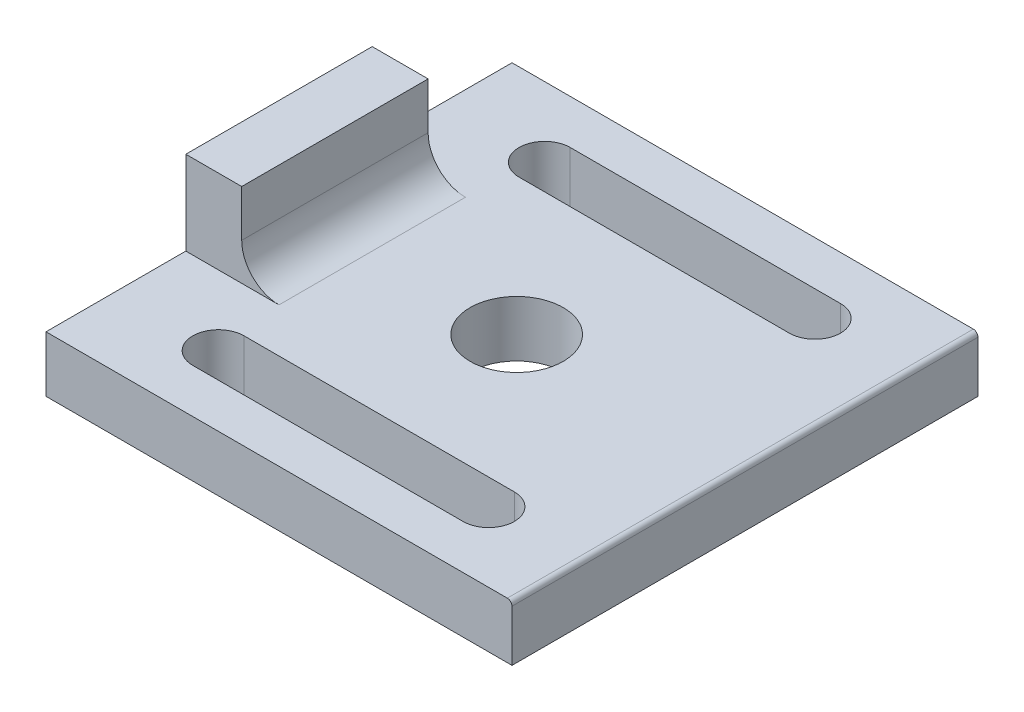
ISO-10303-21;
HEADER;
FILE_DESCRIPTION(('STEP AP214'),'2;1');
FILE_NAME('part.step','',(''),(''),'','','');
FILE_SCHEMA(('AUTOMOTIVE_DESIGN { 1 0 10303 214 1 1 1 1 }'));
ENDSEC;
DATA;
#1=APPLICATION_CONTEXT('core data for automotive mechanical design processes');
#2=APPLICATION_PROTOCOL_DEFINITION('international standard','automotive_design',2000,#1);
#3=PRODUCT_CONTEXT('',#1,'mechanical');
#4=PRODUCT('Part','Part','',(#3));
#5=PRODUCT_RELATED_PRODUCT_CATEGORY('part','',(#4));
#6=PRODUCT_DEFINITION_FORMATION('','',#4);
#7=PRODUCT_DEFINITION_CONTEXT('part definition',#1,'design');
#8=PRODUCT_DEFINITION('design','',#6,#7);
#9=PRODUCT_DEFINITION_SHAPE('','',#8);
#10=(LENGTH_UNIT() NAMED_UNIT(*) SI_UNIT(.MILLI.,.METRE.));
#11=(NAMED_UNIT(*) PLANE_ANGLE_UNIT() SI_UNIT($,.RADIAN.));
#12=(NAMED_UNIT(*) SI_UNIT($,.STERADIAN.) SOLID_ANGLE_UNIT());
#13=UNCERTAINTY_MEASURE_WITH_UNIT(LENGTH_MEASURE(1.E-05),#10,'distance_accuracy_value','');
#14=(GEOMETRIC_REPRESENTATION_CONTEXT(3) GLOBAL_UNCERTAINTY_ASSIGNED_CONTEXT((#13)) GLOBAL_UNIT_ASSIGNED_CONTEXT((#10,
#11,#12)) REPRESENTATION_CONTEXT('',''));
#15=CARTESIAN_POINT('',(0.,0.,0.));
#16=DIRECTION('',(0.,0.,1.));
#17=DIRECTION('',(1.,0.,0.));
#18=AXIS2_PLACEMENT_3D('',#15,#16,#17);
#19=CARTESIAN_POINT('',(-19.5,10.,25.));
#20=DIRECTION('',(-1.,0.,0.));
#21=DIRECTION('',(0.,0.,1.));
#22=AXIS2_PLACEMENT_3D('',#19,#20,#21);
#23=PLANE('',#22);
#24=DIRECTION('',(0.,1.,0.));
#25=VECTOR('',#24,1.);
#26=CARTESIAN_POINT('',(-19.5,21.,-10.));
#27=LINE('',#26,#25);
#28=CARTESIAN_POINT('',(-19.5,10.,-10.));
#29=VERTEX_POINT('',#28);
#30=CARTESIAN_POINT('',(-19.5,15.,-10.));
#31=VERTEX_POINT('',#30);
#32=EDGE_CURVE('E134',#29,#31,#27,.T.);
#33=ORIENTED_EDGE('',*,*,#32,.T.);
#34=DIRECTION('',(0.,0.,-1.));
#35=VECTOR('',#34,1.);
#36=CARTESIAN_POINT('',(-19.5,15.,25.));
#37=LINE('',#36,#35);
#38=CARTESIAN_POINT('',(-19.5,15.,10.));
#39=VERTEX_POINT('',#38);
#40=EDGE_CURVE('E137',#31,#39,#37,.F.);
#41=ORIENTED_EDGE('',*,*,#40,.T.);
#42=DIRECTION('',(0.,1.,0.));
#43=VECTOR('',#42,1.);
#44=CARTESIAN_POINT('',(-19.5,6.,10.));
#45=LINE('',#44,#43);
#46=CARTESIAN_POINT('',(-19.5,10.,10.));
#47=VERTEX_POINT('',#46);
#48=EDGE_CURVE('E122',#39,#47,#45,.F.);
#49=ORIENTED_EDGE('',*,*,#48,.T.);
#50=DIRECTION('',(0.,0.,1.));
#51=VECTOR('',#50,1.);
#52=CARTESIAN_POINT('',(-19.5,10.,25.));
#53=LINE('',#52,#51);
#54=EDGE_CURVE('E112',#47,#29,#53,.F.);
#55=ORIENTED_EDGE('',*,*,#54,.T.);
#56=EDGE_LOOP('',(#33,#41,#49,#55));
#57=FACE_BOUND('',#56,.T.);
#58=ADVANCED_FACE('F17',(#57),#23,.F.);
#59=CARTESIAN_POINT('',(-15.5,10.,25.));
#60=DIRECTION('',(0.,0.,1.));
#61=DIRECTION('',(1.,0.,0.));
#62=AXIS2_PLACEMENT_3D('',#59,#60,#61);
#63=CYLINDRICAL_SURFACE('',#62,4.);
#64=ORIENTED_EDGE('',*,*,#54,.F.);
#65=CARTESIAN_POINT('',(-15.5,10.,10.));
#66=DIRECTION('',(0.,0.,1.));
#67=DIRECTION('',(1.,0.,0.));
#68=AXIS2_PLACEMENT_3D('',#65,#66,#67);
#69=CIRCLE('',#68,4.);
#70=CARTESIAN_POINT('',(-15.5,6.,10.));
#71=VERTEX_POINT('',#70);
#72=EDGE_CURVE('E20',#47,#71,#69,.T.);
#73=ORIENTED_EDGE('',*,*,#72,.T.);
#74=DIRECTION('',(0.,0.,-1.));
#75=VECTOR('',#74,1.);
#76=CARTESIAN_POINT('',(-15.5,6.,25.));
#77=LINE('',#76,#75);
#78=CARTESIAN_POINT('',(-15.5,6.,-10.));
#79=VERTEX_POINT('',#78);
#80=EDGE_CURVE('E163',#71,#79,#77,.T.);
#81=ORIENTED_EDGE('',*,*,#80,.T.);
#82=CARTESIAN_POINT('',(-15.5,10.,-10.));
#83=DIRECTION('',(0.,0.,1.));
#84=DIRECTION('',(1.,0.,0.));
#85=AXIS2_PLACEMENT_3D('',#82,#83,#84);
#86=CIRCLE('',#85,4.);
#87=EDGE_CURVE('E117',#79,#29,#86,.F.);
#88=ORIENTED_EDGE('',*,*,#87,.T.);
#89=EDGE_LOOP('',(#64,#73,#81,#88));
#90=FACE_BOUND('',#89,.T.);
#91=ADVANCED_FACE('F114',(#90),#63,.F.);
#92=CARTESIAN_POINT('',(-25.5,6.,10.));
#93=DIRECTION('',(0.,0.,-1.));
#94=DIRECTION('',(-1.,0.,0.));
#95=AXIS2_PLACEMENT_3D('',#92,#93,#94);
#96=PLANE('',#95);
#97=ORIENTED_EDGE('',*,*,#48,.F.);
#98=DIRECTION('',(1.,0.,0.));
#99=VECTOR('',#98,1.);
#100=CARTESIAN_POINT('',(-19.5,15.,10.));
#101=LINE('',#100,#99);
#102=CARTESIAN_POINT('',(-25.5,15.,10.));
#103=VERTEX_POINT('',#102);
#104=EDGE_CURVE('E149',#39,#103,#101,.F.);
#105=ORIENTED_EDGE('',*,*,#104,.T.);
#106=DIRECTION('',(0.,1.,0.));
#107=VECTOR('',#106,1.);
#108=CARTESIAN_POINT('',(-25.5,15.,10.));
#109=LINE('',#108,#107);
#110=CARTESIAN_POINT('',(-25.5,6.,10.));
#111=VERTEX_POINT('',#110);
#112=EDGE_CURVE('E251',#103,#111,#109,.F.);
#113=ORIENTED_EDGE('',*,*,#112,.T.);
#114=DIRECTION('',(1.,0.,0.));
#115=VECTOR('',#114,1.);
#116=CARTESIAN_POINT('',(24.,6.,10.));
#117=LINE('',#116,#115);
#118=EDGE_CURVE('E132',#111,#71,#117,.T.);
#119=ORIENTED_EDGE('',*,*,#118,.T.);
#120=ORIENTED_EDGE('',*,*,#72,.F.);
#121=EDGE_LOOP('',(#97,#105,#113,#119,#120));
#122=FACE_BOUND('',#121,.T.);
#123=ADVANCED_FACE('F127',(#122),#96,.F.);
#124=CARTESIAN_POINT('',(-25.5,21.,-10.));
#125=DIRECTION('',(0.,0.,1.));
#126=DIRECTION('',(1.,0.,0.));
#127=AXIS2_PLACEMENT_3D('',#124,#125,#126);
#128=PLANE('',#127);
#129=DIRECTION('',(1.,0.,0.));
#130=VECTOR('',#129,1.);
#131=CARTESIAN_POINT('',(24.,6.,-10.));
#132=LINE('',#131,#130);
#133=CARTESIAN_POINT('',(-25.5,6.,-10.));
#134=VERTEX_POINT('',#133);
#135=EDGE_CURVE('E166',#79,#134,#132,.F.);
#136=ORIENTED_EDGE('',*,*,#135,.T.);
#137=DIRECTION('',(0.,1.,0.));
#138=VECTOR('',#137,1.);
#139=CARTESIAN_POINT('',(-25.5,15.,-10.));
#140=LINE('',#139,#138);
#141=CARTESIAN_POINT('',(-25.5,15.,-10.));
#142=VERTEX_POINT('',#141);
#143=EDGE_CURVE('E160',#134,#142,#140,.T.);
#144=ORIENTED_EDGE('',*,*,#143,.T.);
#145=DIRECTION('',(1.,0.,0.));
#146=VECTOR('',#145,1.);
#147=CARTESIAN_POINT('',(-19.5,15.,-10.));
#148=LINE('',#147,#146);
#149=EDGE_CURVE('E152',#142,#31,#148,.T.);
#150=ORIENTED_EDGE('',*,*,#149,.T.);
#151=ORIENTED_EDGE('',*,*,#32,.F.);
#152=ORIENTED_EDGE('',*,*,#87,.F.);
#153=EDGE_LOOP('',(#136,#144,#150,#151,#152));
#154=FACE_BOUND('',#153,.T.);
#155=ADVANCED_FACE('F412',(#154),#128,.F.);
#156=CARTESIAN_POINT('',(-19.5,15.,25.));
#157=DIRECTION('',(0.,-1.,0.));
#158=DIRECTION('',(0.,0.,-1.));
#159=AXIS2_PLACEMENT_3D('',#156,#157,#158);
#160=PLANE('',#159);
#161=ORIENTED_EDGE('',*,*,#149,.F.);
#162=DIRECTION('',(0.,0.,-1.));
#163=VECTOR('',#162,1.);
#164=CARTESIAN_POINT('',(-25.5,15.,25.));
#165=LINE('',#164,#163);
#166=EDGE_CURVE('E155',#142,#103,#165,.F.);
#167=ORIENTED_EDGE('',*,*,#166,.T.);
#168=ORIENTED_EDGE('',*,*,#104,.F.);
#169=ORIENTED_EDGE('',*,*,#40,.F.);
#170=EDGE_LOOP('',(#161,#167,#168,#169));
#171=FACE_BOUND('',#170,.T.);
#172=ADVANCED_FACE('F410',(#171),#160,.F.);
#173=CARTESIAN_POINT('',(24.,5.5,25.));
#174=DIRECTION('',(0.,0.,1.));
#175=DIRECTION('',(1.,0.,0.));
#176=AXIS2_PLACEMENT_3D('',#173,#174,#175);
#177=CYLINDRICAL_SURFACE('',#176,0.500000000000007);
#178=CARTESIAN_POINT('',(24.,5.5,25.));
#179=DIRECTION('',(0.,0.,1.));
#180=DIRECTION('',(1.,0.,0.));
#181=AXIS2_PLACEMENT_3D('',#178,#179,#180);
#182=CIRCLE('',#181,0.500000000000007);
#183=CARTESIAN_POINT('',(24.5,5.50000000000001,25.));
#184=VERTEX_POINT('',#183);
#185=CARTESIAN_POINT('',(24.,6.00000000000001,25.));
#186=VERTEX_POINT('',#185);
#187=EDGE_CURVE('E228',#184,#186,#182,.T.);
#188=ORIENTED_EDGE('',*,*,#187,.F.);
#189=DIRECTION('',(0.,0.,1.));
#190=VECTOR('',#189,1.);
#191=CARTESIAN_POINT('',(24.5,5.50000000000002,25.));
#192=LINE('',#191,#190);
#193=CARTESIAN_POINT('',(24.5,5.50000000000001,-25.));
#194=VERTEX_POINT('',#193);
#195=EDGE_CURVE('E319',#184,#194,#192,.F.);
#196=ORIENTED_EDGE('',*,*,#195,.T.);
#197=CARTESIAN_POINT('',(24.,5.5,-25.));
#198=DIRECTION('',(0.,0.,1.));
#199=DIRECTION('',(1.,0.,0.));
#200=AXIS2_PLACEMENT_3D('',#197,#198,#199);
#201=CIRCLE('',#200,0.500000000000007);
#202=CARTESIAN_POINT('',(24.,6.,-25.));
#203=VERTEX_POINT('',#202);
#204=EDGE_CURVE('E169',#194,#203,#201,.T.);
#205=ORIENTED_EDGE('',*,*,#204,.T.);
#206=DIRECTION('',(0.,0.,-1.));
#207=VECTOR('',#206,1.);
#208=CARTESIAN_POINT('',(24.,6.,25.));
#209=LINE('',#208,#207);
#210=EDGE_CURVE('E235',#203,#186,#209,.F.);
#211=ORIENTED_EDGE('',*,*,#210,.T.);
#212=EDGE_LOOP('',(#188,#196,#205,#211));
#213=FACE_BOUND('',#212,.T.);
#214=ADVANCED_FACE('F397',(#213),#177,.T.);
#215=CARTESIAN_POINT('',(24.,6.,25.));
#216=DIRECTION('',(0.,-1.,0.));
#217=DIRECTION('',(0.,0.,-1.));
#218=AXIS2_PLACEMENT_3D('',#215,#216,#217);
#219=PLANE('',#218);
#220=CARTESIAN_POINT('',(14.5,6.,17.5));
#221=DIRECTION('',(0.,1.,0.));
#222=DIRECTION('',(0.,0.,1.));
#223=AXIS2_PLACEMENT_3D('',#220,#221,#222);
#224=CIRCLE('',#223,2.75);
#225=CARTESIAN_POINT('',(14.5,6.,14.75));
#226=VERTEX_POINT('',#225);
#227=CARTESIAN_POINT('',(14.5,6.,20.25));
#228=VERTEX_POINT('',#227);
#229=EDGE_CURVE('E206',#226,#228,#224,.F.);
#230=ORIENTED_EDGE('',*,*,#229,.T.);
#231=DIRECTION('',(-1.,0.,0.));
#232=VECTOR('',#231,1.);
#233=CARTESIAN_POINT('',(-14.5,6.,20.25));
#234=LINE('',#233,#232);
#235=CARTESIAN_POINT('',(-14.5,6.,20.25));
#236=VERTEX_POINT('',#235);
#237=EDGE_CURVE('E210',#236,#228,#234,.F.);
#238=ORIENTED_EDGE('',*,*,#237,.F.);
#239=CARTESIAN_POINT('',(-14.5,6.,17.5));
#240=DIRECTION('',(0.,1.,0.));
#241=DIRECTION('',(0.,0.,1.));
#242=AXIS2_PLACEMENT_3D('',#239,#240,#241);
#243=CIRCLE('',#242,2.75);
#244=CARTESIAN_POINT('',(-14.5,6.,14.75));
#245=VERTEX_POINT('',#244);
#246=EDGE_CURVE('E200',#236,#245,#243,.F.);
#247=ORIENTED_EDGE('',*,*,#246,.T.);
#248=DIRECTION('',(1.,0.,0.));
#249=VECTOR('',#248,1.);
#250=CARTESIAN_POINT('',(14.5,6.,14.75));
#251=LINE('',#250,#249);
#252=EDGE_CURVE('E298',#226,#245,#251,.F.);
#253=ORIENTED_EDGE('',*,*,#252,.F.);
#254=EDGE_LOOP('',(#230,#238,#247,#253));
#255=FACE_BOUND('',#254,.T.);
#256=CARTESIAN_POINT('',(0.,6.,0.));
#257=DIRECTION('',(0.,1.,0.));
#258=DIRECTION('',(0.,0.,1.));
#259=AXIS2_PLACEMENT_3D('',#256,#257,#258);
#260=CIRCLE('',#259,5.);
#261=CARTESIAN_POINT('',(0.,6.,5.));
#262=VERTEX_POINT('',#261);
#263=EDGE_CURVE('E211',#262,#262,#260,.F.);
#264=ORIENTED_EDGE('',*,*,#263,.T.);
#265=EDGE_LOOP('',(#264));
#266=FACE_BOUND('',#265,.T.);
#267=CARTESIAN_POINT('',(14.5,6.,-17.5));
#268=DIRECTION('',(0.,1.,0.));
#269=DIRECTION('',(0.,0.,1.));
#270=AXIS2_PLACEMENT_3D('',#267,#268,#269);
#271=CIRCLE('',#270,2.75);
#272=CARTESIAN_POINT('',(14.5,6.,-20.25));
#273=VERTEX_POINT('',#272);
#274=CARTESIAN_POINT('',(14.5,6.,-14.75));
#275=VERTEX_POINT('',#274);
#276=EDGE_CURVE('E222',#273,#275,#271,.F.);
#277=ORIENTED_EDGE('',*,*,#276,.T.);
#278=DIRECTION('',(-1.,0.,0.));
#279=VECTOR('',#278,1.);
#280=CARTESIAN_POINT('',(-14.5,6.,-14.75));
#281=LINE('',#280,#279);
#282=CARTESIAN_POINT('',(-14.5,6.,-14.75));
#283=VERTEX_POINT('',#282);
#284=EDGE_CURVE('E226',#283,#275,#281,.F.);
#285=ORIENTED_EDGE('',*,*,#284,.F.);
#286=CARTESIAN_POINT('',(-14.5,6.,-17.5));
#287=DIRECTION('',(0.,1.,0.));
#288=DIRECTION('',(0.,0.,1.));
#289=AXIS2_PLACEMENT_3D('',#286,#287,#288);
#290=CIRCLE('',#289,2.75);
#291=CARTESIAN_POINT('',(-14.5,6.,-20.25));
#292=VERTEX_POINT('',#291);
#293=EDGE_CURVE('E216',#283,#292,#290,.F.);
#294=ORIENTED_EDGE('',*,*,#293,.T.);
#295=DIRECTION('',(1.,0.,0.));
#296=VECTOR('',#295,1.);
#297=CARTESIAN_POINT('',(14.5,6.,-20.25));
#298=LINE('',#297,#296);
#299=EDGE_CURVE('E304',#273,#292,#298,.F.);
#300=ORIENTED_EDGE('',*,*,#299,.F.);
#301=EDGE_LOOP('',(#277,#285,#294,#300));
#302=FACE_BOUND('',#301,.T.);
#303=ORIENTED_EDGE('',*,*,#80,.F.);
#304=ORIENTED_EDGE('',*,*,#118,.F.);
#305=DIRECTION('',(0.,0.,-1.));
#306=VECTOR('',#305,1.);
#307=CARTESIAN_POINT('',(-25.5,6.,25.));
#308=LINE('',#307,#306);
#309=CARTESIAN_POINT('',(-25.5,6.00000000000001,25.));
#310=VERTEX_POINT('',#309);
#311=EDGE_CURVE('E264',#111,#310,#308,.F.);
#312=ORIENTED_EDGE('',*,*,#311,.T.);
#313=DIRECTION('',(1.,0.,0.));
#314=VECTOR('',#313,1.);
#315=CARTESIAN_POINT('',(24.,6.00000000000001,25.));
#316=LINE('',#315,#314);
#317=EDGE_CURVE('E159',#186,#310,#316,.F.);
#318=ORIENTED_EDGE('',*,*,#317,.F.);
#319=ORIENTED_EDGE('',*,*,#210,.F.);
#320=DIRECTION('',(1.,0.,0.));
#321=VECTOR('',#320,1.);
#322=CARTESIAN_POINT('',(24.,6.,-25.));
#323=LINE('',#322,#321);
#324=CARTESIAN_POINT('',(-25.5,6.,-25.));
#325=VERTEX_POINT('',#324);
#326=EDGE_CURVE('E314',#203,#325,#323,.F.);
#327=ORIENTED_EDGE('',*,*,#326,.T.);
#328=DIRECTION('',(0.,0.,-1.));
#329=VECTOR('',#328,1.);
#330=CARTESIAN_POINT('',(-25.5,6.,25.));
#331=LINE('',#330,#329);
#332=EDGE_CURVE('E257',#325,#134,#331,.F.);
#333=ORIENTED_EDGE('',*,*,#332,.T.);
#334=ORIENTED_EDGE('',*,*,#135,.F.);
#335=EDGE_LOOP('',(#303,#304,#312,#318,#319,#327,#333,#334));
#336=FACE_BOUND('',#335,.T.);
#337=ADVANCED_FACE('F393',(#255,#266,#302,#336),#219,.F.);
#338=CARTESIAN_POINT('',(-25.5,15.,25.));
#339=DIRECTION('',(1.,0.,0.));
#340=DIRECTION('',(0.,0.,-1.));
#341=AXIS2_PLACEMENT_3D('',#338,#339,#340);
#342=PLANE('',#341);
#343=ORIENTED_EDGE('',*,*,#143,.F.);
#344=ORIENTED_EDGE('',*,*,#332,.F.);
#345=DIRECTION('',(0.,1.,0.));
#346=VECTOR('',#345,1.);
#347=CARTESIAN_POINT('',(-25.5,5.5,-25.));
#348=LINE('',#347,#346);
#349=CARTESIAN_POINT('',(-25.5,0.,-25.));
#350=VERTEX_POINT('',#349);
#351=EDGE_CURVE('E227',#325,#350,#348,.F.);
#352=ORIENTED_EDGE('',*,*,#351,.T.);
#353=DIRECTION('',(0.,0.,1.));
#354=VECTOR('',#353,1.);
#355=CARTESIAN_POINT('',(-25.5,0.,25.));
#356=LINE('',#355,#354);
#357=CARTESIAN_POINT('',(-25.5,0.,25.));
#358=VERTEX_POINT('',#357);
#359=EDGE_CURVE('E341',#350,#358,#356,.T.);
#360=ORIENTED_EDGE('',*,*,#359,.T.);
#361=DIRECTION('',(0.,1.,0.));
#362=VECTOR('',#361,1.);
#363=CARTESIAN_POINT('',(-25.5,5.5,25.));
#364=LINE('',#363,#362);
#365=EDGE_CURVE('E233',#310,#358,#364,.F.);
#366=ORIENTED_EDGE('',*,*,#365,.F.);
#367=ORIENTED_EDGE('',*,*,#311,.F.);
#368=ORIENTED_EDGE('',*,*,#112,.F.);
#369=ORIENTED_EDGE('',*,*,#166,.F.);
#370=EDGE_LOOP('',(#343,#344,#352,#360,#366,#367,#368,#369));
#371=FACE_BOUND('',#370,.T.);
#372=ADVANCED_FACE('F390',(#371),#342,.F.);
#373=CARTESIAN_POINT('',(24.,5.5,25.));
#374=DIRECTION('',(0.,0.,1.));
#375=DIRECTION('',(1.,0.,0.));
#376=AXIS2_PLACEMENT_3D('',#373,#374,#375);
#377=PLANE('',#376);
#378=DIRECTION('',(0.,1.,0.));
#379=VECTOR('',#378,1.);
#380=CARTESIAN_POINT('',(24.5,0.,25.));
#381=LINE('',#380,#379);
#382=CARTESIAN_POINT('',(24.5,0.,25.));
#383=VERTEX_POINT('',#382);
#384=EDGE_CURVE('E232',#383,#184,#381,.T.);
#385=ORIENTED_EDGE('',*,*,#384,.T.);
#386=ORIENTED_EDGE('',*,*,#187,.T.);
#387=ORIENTED_EDGE('',*,*,#317,.T.);
#388=ORIENTED_EDGE('',*,*,#365,.T.);
#389=DIRECTION('',(1.,0.,0.));
#390=VECTOR('',#389,1.);
#391=CARTESIAN_POINT('',(-25.5,0.,25.));
#392=LINE('',#391,#390);
#393=EDGE_CURVE('E333',#358,#383,#392,.T.);
#394=ORIENTED_EDGE('',*,*,#393,.T.);
#395=EDGE_LOOP('',(#385,#386,#387,#388,#394));
#396=FACE_BOUND('',#395,.T.);
#397=ADVANCED_FACE('F398',(#396),#377,.T.);
#398=CARTESIAN_POINT('',(24.5,0.,25.));
#399=DIRECTION('',(-1.,0.,0.));
#400=DIRECTION('',(0.,0.,1.));
#401=AXIS2_PLACEMENT_3D('',#398,#399,#400);
#402=PLANE('',#401);
#403=ORIENTED_EDGE('',*,*,#195,.F.);
#404=ORIENTED_EDGE('',*,*,#384,.F.);
#405=DIRECTION('',(0.,0.,1.));
#406=VECTOR('',#405,1.);
#407=CARTESIAN_POINT('',(24.5,0.,25.));
#408=LINE('',#407,#406);
#409=CARTESIAN_POINT('',(24.5,0.,-25.));
#410=VERTEX_POINT('',#409);
#411=EDGE_CURVE('E327',#383,#410,#408,.F.);
#412=ORIENTED_EDGE('',*,*,#411,.T.);
#413=DIRECTION('',(0.,1.,0.));
#414=VECTOR('',#413,1.);
#415=CARTESIAN_POINT('',(24.5,5.5,-25.));
#416=LINE('',#415,#414);
#417=EDGE_CURVE('E323',#410,#194,#416,.T.);
#418=ORIENTED_EDGE('',*,*,#417,.T.);
#419=EDGE_LOOP('',(#403,#404,#412,#418));
#420=FACE_BOUND('',#419,.T.);
#421=ADVANCED_FACE('F376',(#420),#402,.F.);
#422=CARTESIAN_POINT('',(24.,5.5,-25.));
#423=DIRECTION('',(0.,0.,1.));
#424=DIRECTION('',(1.,0.,0.));
#425=AXIS2_PLACEMENT_3D('',#422,#423,#424);
#426=PLANE('',#425);
#427=ORIENTED_EDGE('',*,*,#326,.F.);
#428=ORIENTED_EDGE('',*,*,#204,.F.);
#429=ORIENTED_EDGE('',*,*,#417,.F.);
#430=DIRECTION('',(1.,0.,0.));
#431=VECTOR('',#430,1.);
#432=CARTESIAN_POINT('',(-25.5,0.,-25.));
#433=LINE('',#432,#431);
#434=EDGE_CURVE('E199',#410,#350,#433,.F.);
#435=ORIENTED_EDGE('',*,*,#434,.T.);
#436=ORIENTED_EDGE('',*,*,#351,.F.);
#437=EDGE_LOOP('',(#427,#428,#429,#435,#436));
#438=FACE_BOUND('',#437,.T.);
#439=ADVANCED_FACE('F382',(#438),#426,.F.);
#440=CARTESIAN_POINT('',(14.5,6.,-17.5));
#441=DIRECTION('',(0.,1.,0.));
#442=DIRECTION('',(0.,0.,1.));
#443=AXIS2_PLACEMENT_3D('',#440,#441,#442);
#444=CYLINDRICAL_SURFACE('',#443,2.75);
#445=DIRECTION('',(0.,1.,0.));
#446=VECTOR('',#445,1.);
#447=CARTESIAN_POINT('',(14.5,6.,-14.75));
#448=LINE('',#447,#446);
#449=CARTESIAN_POINT('',(14.5,0.,-14.75));
#450=VERTEX_POINT('',#449);
#451=EDGE_CURVE('E308',#275,#450,#448,.F.);
#452=ORIENTED_EDGE('',*,*,#451,.F.);
#453=ORIENTED_EDGE('',*,*,#276,.F.);
#454=DIRECTION('',(0.,1.,0.));
#455=VECTOR('',#454,1.);
#456=CARTESIAN_POINT('',(14.5,6.,-20.25));
#457=LINE('',#456,#455);
#458=CARTESIAN_POINT('',(14.5,0.,-20.25));
#459=VERTEX_POINT('',#458);
#460=EDGE_CURVE('E220',#459,#273,#457,.T.);
#461=ORIENTED_EDGE('',*,*,#460,.F.);
#462=CARTESIAN_POINT('',(14.5,0.,-17.5));
#463=DIRECTION('',(0.,1.,0.));
#464=DIRECTION('',(0.,0.,1.));
#465=AXIS2_PLACEMENT_3D('',#462,#463,#464);
#466=CIRCLE('',#465,2.75);
#467=EDGE_CURVE('E195',#459,#450,#466,.F.);
#468=ORIENTED_EDGE('',*,*,#467,.T.);
#469=EDGE_LOOP('',(#452,#453,#461,#468));
#470=FACE_BOUND('',#469,.T.);
#471=ADVANCED_FACE('F458',(#470),#444,.F.);
#472=CARTESIAN_POINT('',(-14.5,6.,-14.75));
#473=DIRECTION('',(0.,0.,-1.));
#474=DIRECTION('',(-1.,0.,0.));
#475=AXIS2_PLACEMENT_3D('',#472,#473,#474);
#476=PLANE('',#475);
#477=ORIENTED_EDGE('',*,*,#284,.T.);
#478=ORIENTED_EDGE('',*,*,#451,.T.);
#479=DIRECTION('',(1.,0.,0.));
#480=VECTOR('',#479,1.);
#481=CARTESIAN_POINT('',(-25.5,0.,-14.75));
#482=LINE('',#481,#480);
#483=CARTESIAN_POINT('',(-14.5,0.,-14.75));
#484=VERTEX_POINT('',#483);
#485=EDGE_CURVE('E194',#450,#484,#482,.F.);
#486=ORIENTED_EDGE('',*,*,#485,.T.);
#487=DIRECTION('',(0.,1.,0.));
#488=VECTOR('',#487,1.);
#489=CARTESIAN_POINT('',(-14.5,6.,-14.75));
#490=LINE('',#489,#488);
#491=EDGE_CURVE('E221',#484,#283,#490,.T.);
#492=ORIENTED_EDGE('',*,*,#491,.T.);
#493=EDGE_LOOP('',(#477,#478,#486,#492));
#494=FACE_BOUND('',#493,.T.);
#495=ADVANCED_FACE('F454',(#494),#476,.T.);
#496=CARTESIAN_POINT('',(-14.5,6.,-17.5));
#497=DIRECTION('',(0.,1.,0.));
#498=DIRECTION('',(0.,0.,1.));
#499=AXIS2_PLACEMENT_3D('',#496,#497,#498);
#500=CYLINDRICAL_SURFACE('',#499,2.75);
#501=DIRECTION('',(0.,1.,0.));
#502=VECTOR('',#501,1.);
#503=CARTESIAN_POINT('',(-14.5,6.,-20.25));
#504=LINE('',#503,#502);
#505=CARTESIAN_POINT('',(-14.5,0.,-20.25));
#506=VERTEX_POINT('',#505);
#507=EDGE_CURVE('E215',#292,#506,#504,.F.);
#508=ORIENTED_EDGE('',*,*,#507,.F.);
#509=ORIENTED_EDGE('',*,*,#293,.F.);
#510=ORIENTED_EDGE('',*,*,#491,.F.);
#511=CARTESIAN_POINT('',(-14.5,0.,-17.5));
#512=DIRECTION('',(0.,1.,0.));
#513=DIRECTION('',(0.,0.,1.));
#514=AXIS2_PLACEMENT_3D('',#511,#512,#513);
#515=CIRCLE('',#514,2.75);
#516=EDGE_CURVE('E190',#484,#506,#515,.F.);
#517=ORIENTED_EDGE('',*,*,#516,.T.);
#518=EDGE_LOOP('',(#508,#509,#510,#517));
#519=FACE_BOUND('',#518,.T.);
#520=ADVANCED_FACE('F450',(#519),#500,.F.);
#521=CARTESIAN_POINT('',(14.5,6.,-20.25));
#522=DIRECTION('',(0.,0.,1.));
#523=DIRECTION('',(1.,0.,0.));
#524=AXIS2_PLACEMENT_3D('',#521,#522,#523);
#525=PLANE('',#524);
#526=ORIENTED_EDGE('',*,*,#299,.T.);
#527=ORIENTED_EDGE('',*,*,#507,.T.);
#528=DIRECTION('',(1.,0.,0.));
#529=VECTOR('',#528,1.);
#530=CARTESIAN_POINT('',(-25.5,0.,-20.25));
#531=LINE('',#530,#529);
#532=EDGE_CURVE('E189',#506,#459,#531,.T.);
#533=ORIENTED_EDGE('',*,*,#532,.T.);
#534=ORIENTED_EDGE('',*,*,#460,.T.);
#535=EDGE_LOOP('',(#526,#527,#533,#534));
#536=FACE_BOUND('',#535,.T.);
#537=ADVANCED_FACE('F446',(#536),#525,.T.);
#538=CARTESIAN_POINT('',(0.,6.,0.));
#539=DIRECTION('',(0.,1.,0.));
#540=DIRECTION('',(0.,0.,1.));
#541=AXIS2_PLACEMENT_3D('',#538,#539,#540);
#542=CYLINDRICAL_SURFACE('',#541,5.);
#543=CARTESIAN_POINT('',(0.,0.,0.));
#544=DIRECTION('',(0.,1.,0.));
#545=DIRECTION('',(0.,0.,1.));
#546=AXIS2_PLACEMENT_3D('',#543,#544,#545);
#547=CIRCLE('',#546,5.);
#548=CARTESIAN_POINT('',(0.,0.,5.));
#549=VERTEX_POINT('',#548);
#550=EDGE_CURVE('E185',#549,#549,#547,.F.);
#551=ORIENTED_EDGE('',*,*,#550,.T.);
#552=EDGE_LOOP('',(#551));
#553=FACE_BOUND('',#552,.T.);
#554=ORIENTED_EDGE('',*,*,#263,.F.);
#555=EDGE_LOOP('',(#554));
#556=FACE_BOUND('',#555,.T.);
#557=ADVANCED_FACE('F442',(#553,#556),#542,.F.);
#558=CARTESIAN_POINT('',(14.5,6.,17.5));
#559=DIRECTION('',(0.,1.,0.));
#560=DIRECTION('',(0.,0.,1.));
#561=AXIS2_PLACEMENT_3D('',#558,#559,#560);
#562=CYLINDRICAL_SURFACE('',#561,2.75);
#563=DIRECTION('',(0.,1.,0.));
#564=VECTOR('',#563,1.);
#565=CARTESIAN_POINT('',(14.5,6.,20.25));
#566=LINE('',#565,#564);
#567=CARTESIAN_POINT('',(14.5,0.,20.25));
#568=VERTEX_POINT('',#567);
#569=EDGE_CURVE('E303',#228,#568,#566,.F.);
#570=ORIENTED_EDGE('',*,*,#569,.F.);
#571=ORIENTED_EDGE('',*,*,#229,.F.);
#572=DIRECTION('',(0.,1.,0.));
#573=VECTOR('',#572,1.);
#574=CARTESIAN_POINT('',(14.5,6.,14.75));
#575=LINE('',#574,#573);
#576=CARTESIAN_POINT('',(14.5,0.,14.75));
#577=VERTEX_POINT('',#576);
#578=EDGE_CURVE('E204',#577,#226,#575,.T.);
#579=ORIENTED_EDGE('',*,*,#578,.F.);
#580=CARTESIAN_POINT('',(14.5,0.,17.5));
#581=DIRECTION('',(0.,1.,0.));
#582=DIRECTION('',(0.,0.,1.));
#583=AXIS2_PLACEMENT_3D('',#580,#581,#582);
#584=CIRCLE('',#583,2.75);
#585=EDGE_CURVE('E181',#577,#568,#584,.F.);
#586=ORIENTED_EDGE('',*,*,#585,.T.);
#587=EDGE_LOOP('',(#570,#571,#579,#586));
#588=FACE_BOUND('',#587,.T.);
#589=ADVANCED_FACE('F438',(#588),#562,.F.);
#590=CARTESIAN_POINT('',(-14.5,6.,20.25));
#591=DIRECTION('',(0.,0.,-1.));
#592=DIRECTION('',(-1.,0.,0.));
#593=AXIS2_PLACEMENT_3D('',#590,#591,#592);
#594=PLANE('',#593);
#595=ORIENTED_EDGE('',*,*,#237,.T.);
#596=ORIENTED_EDGE('',*,*,#569,.T.);
#597=DIRECTION('',(1.,0.,0.));
#598=VECTOR('',#597,1.);
#599=CARTESIAN_POINT('',(-25.5,0.,20.25));
#600=LINE('',#599,#598);
#601=CARTESIAN_POINT('',(-14.5,0.,20.25));
#602=VERTEX_POINT('',#601);
#603=EDGE_CURVE('E180',#568,#602,#600,.F.);
#604=ORIENTED_EDGE('',*,*,#603,.T.);
#605=DIRECTION('',(0.,1.,0.));
#606=VECTOR('',#605,1.);
#607=CARTESIAN_POINT('',(-14.5,6.,20.25));
#608=LINE('',#607,#606);
#609=EDGE_CURVE('E205',#602,#236,#608,.T.);
#610=ORIENTED_EDGE('',*,*,#609,.T.);
#611=EDGE_LOOP('',(#595,#596,#604,#610));
#612=FACE_BOUND('',#611,.T.);
#613=ADVANCED_FACE('F434',(#612),#594,.T.);
#614=CARTESIAN_POINT('',(-14.5,6.,17.5));
#615=DIRECTION('',(0.,1.,0.));
#616=DIRECTION('',(0.,0.,1.));
#617=AXIS2_PLACEMENT_3D('',#614,#615,#616);
#618=CYLINDRICAL_SURFACE('',#617,2.75);
#619=DIRECTION('',(0.,1.,0.));
#620=VECTOR('',#619,1.);
#621=CARTESIAN_POINT('',(-14.5,6.,14.75));
#622=LINE('',#621,#620);
#623=CARTESIAN_POINT('',(-14.5,0.,14.75));
#624=VERTEX_POINT('',#623);
#625=EDGE_CURVE('E35',#245,#624,#622,.F.);
#626=ORIENTED_EDGE('',*,*,#625,.F.);
#627=ORIENTED_EDGE('',*,*,#246,.F.);
#628=ORIENTED_EDGE('',*,*,#609,.F.);
#629=CARTESIAN_POINT('',(-14.5,0.,17.5));
#630=DIRECTION('',(0.,1.,0.));
#631=DIRECTION('',(0.,0.,1.));
#632=AXIS2_PLACEMENT_3D('',#629,#630,#631);
#633=CIRCLE('',#632,2.75);
#634=EDGE_CURVE('E27',#602,#624,#633,.F.);
#635=ORIENTED_EDGE('',*,*,#634,.T.);
#636=EDGE_LOOP('',(#626,#627,#628,#635));
#637=FACE_BOUND('',#636,.T.);
#638=ADVANCED_FACE('F427',(#637),#618,.F.);
#639=CARTESIAN_POINT('',(14.5,6.,14.75));
#640=DIRECTION('',(0.,0.,1.));
#641=DIRECTION('',(1.,0.,0.));
#642=AXIS2_PLACEMENT_3D('',#639,#640,#641);
#643=PLANE('',#642);
#644=ORIENTED_EDGE('',*,*,#252,.T.);
#645=ORIENTED_EDGE('',*,*,#625,.T.);
#646=DIRECTION('',(1.,0.,0.));
#647=VECTOR('',#646,1.);
#648=CARTESIAN_POINT('',(-25.5,0.,14.75));
#649=LINE('',#648,#647);
#650=EDGE_CURVE('E11',#624,#577,#649,.T.);
#651=ORIENTED_EDGE('',*,*,#650,.T.);
#652=ORIENTED_EDGE('',*,*,#578,.T.);
#653=EDGE_LOOP('',(#644,#645,#651,#652));
#654=FACE_BOUND('',#653,.T.);
#655=ADVANCED_FACE('F422',(#654),#643,.T.);
#656=CARTESIAN_POINT('',(-25.5,0.,25.));
#657=DIRECTION('',(0.,1.,0.));
#658=DIRECTION('',(0.,0.,1.));
#659=AXIS2_PLACEMENT_3D('',#656,#657,#658);
#660=PLANE('',#659);
#661=ORIENTED_EDGE('',*,*,#634,.F.);
#662=ORIENTED_EDGE('',*,*,#603,.F.);
#663=ORIENTED_EDGE('',*,*,#585,.F.);
#664=ORIENTED_EDGE('',*,*,#650,.F.);
#665=EDGE_LOOP('',(#661,#662,#663,#664));
#666=FACE_BOUND('',#665,.T.);
#667=ORIENTED_EDGE('',*,*,#550,.F.);
#668=EDGE_LOOP('',(#667));
#669=FACE_BOUND('',#668,.T.);
#670=ORIENTED_EDGE('',*,*,#516,.F.);
#671=ORIENTED_EDGE('',*,*,#485,.F.);
#672=ORIENTED_EDGE('',*,*,#467,.F.);
#673=ORIENTED_EDGE('',*,*,#532,.F.);
#674=EDGE_LOOP('',(#670,#671,#672,#673));
#675=FACE_BOUND('',#674,.T.);
#676=ORIENTED_EDGE('',*,*,#411,.F.);
#677=ORIENTED_EDGE('',*,*,#393,.F.);
#678=ORIENTED_EDGE('',*,*,#359,.F.);
#679=ORIENTED_EDGE('',*,*,#434,.F.);
#680=EDGE_LOOP('',(#676,#677,#678,#679));
#681=FACE_BOUND('',#680,.T.);
#682=ADVANCED_FACE('F386',(#666,#669,#675,#681),#660,.F.);
#683=CLOSED_SHELL('',(#58,#91,#123,#155,#172,#214,#337,#372,#397,#421,#439,#471,#495,#520,#537,
#557,#589,#613,#638,#655,#682));
#684=MANIFOLD_SOLID_BREP('B1',#683);
#685=ADVANCED_BREP_SHAPE_REPRESENTATION('',(#18,#684),#14);
#686=SHAPE_DEFINITION_REPRESENTATION(#9,#685);
ENDSEC;
END-ISO-10303-21;
